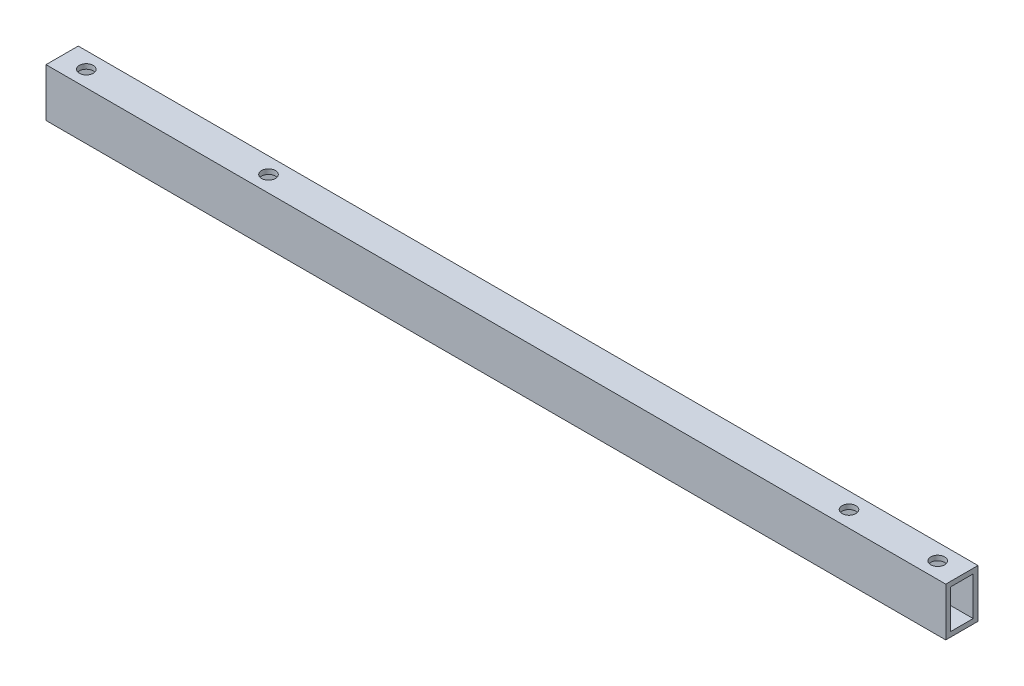
ISO-10303-21;
HEADER;
FILE_DESCRIPTION(('STEP AP214'),'2;1');
FILE_NAME('part.step','',(''),(''),'','','');
FILE_SCHEMA(('AUTOMOTIVE_DESIGN { 1 0 10303 214 1 1 1 1 }'));
ENDSEC;
DATA;
#1=APPLICATION_CONTEXT('core data for automotive mechanical design processes');
#2=APPLICATION_PROTOCOL_DEFINITION('international standard','automotive_design',2000,#1);
#3=PRODUCT_CONTEXT('',#1,'mechanical');
#4=PRODUCT('Part','Part','',(#3));
#5=PRODUCT_RELATED_PRODUCT_CATEGORY('part','',(#4));
#6=PRODUCT_DEFINITION_FORMATION('','',#4);
#7=PRODUCT_DEFINITION_CONTEXT('part definition',#1,'design');
#8=PRODUCT_DEFINITION('design','',#6,#7);
#9=PRODUCT_DEFINITION_SHAPE('','',#8);
#10=(LENGTH_UNIT() NAMED_UNIT(*) SI_UNIT(.MILLI.,.METRE.));
#11=(NAMED_UNIT(*) PLANE_ANGLE_UNIT() SI_UNIT($,.RADIAN.));
#12=(NAMED_UNIT(*) SI_UNIT($,.STERADIAN.) SOLID_ANGLE_UNIT());
#13=UNCERTAINTY_MEASURE_WITH_UNIT(LENGTH_MEASURE(1.E-05),#10,'distance_accuracy_value','');
#14=(GEOMETRIC_REPRESENTATION_CONTEXT(3) GLOBAL_UNCERTAINTY_ASSIGNED_CONTEXT((#13)) GLOBAL_UNIT_ASSIGNED_CONTEXT((#10,
#11,#12)) REPRESENTATION_CONTEXT('',''));
#15=CARTESIAN_POINT('',(0.,0.,0.));
#16=DIRECTION('',(0.,0.,1.));
#17=DIRECTION('',(1.,0.,0.));
#18=AXIS2_PLACEMENT_3D('',#15,#16,#17);
#19=CARTESIAN_POINT('',(279.,0.,0.));
#20=DIRECTION('',(1.,0.,0.));
#21=DIRECTION('',(0.,0.,-1.));
#22=AXIS2_PLACEMENT_3D('',#19,#20,#21);
#23=PLANE('',#22);
#24=DIRECTION('',(0.,1.,0.));
#25=VECTOR('',#24,1.);
#26=CARTESIAN_POINT('',(279.,7.5,-5.));
#27=LINE('',#26,#25);
#28=CARTESIAN_POINT('',(279.,-7.5,-5.));
#29=VERTEX_POINT('',#28);
#30=CARTESIAN_POINT('',(279.,7.5,-5.));
#31=VERTEX_POINT('',#30);
#32=EDGE_CURVE('E164',#29,#31,#27,.T.);
#33=ORIENTED_EDGE('',*,*,#32,.T.);
#34=DIRECTION('',(0.,0.,1.));
#35=VECTOR('',#34,1.);
#36=CARTESIAN_POINT('',(279.,7.5,5.));
#37=LINE('',#36,#35);
#38=CARTESIAN_POINT('',(279.,7.5,5.));
#39=VERTEX_POINT('',#38);
#40=EDGE_CURVE('E167',#31,#39,#37,.T.);
#41=ORIENTED_EDGE('',*,*,#40,.T.);
#42=DIRECTION('',(0.,-1.,0.));
#43=VECTOR('',#42,1.);
#44=CARTESIAN_POINT('',(279.,7.5,5.));
#45=LINE('',#44,#43);
#46=CARTESIAN_POINT('',(279.,-7.5,5.));
#47=VERTEX_POINT('',#46);
#48=EDGE_CURVE('E170',#39,#47,#45,.T.);
#49=ORIENTED_EDGE('',*,*,#48,.T.);
#50=DIRECTION('',(0.,0.,-1.));
#51=VECTOR('',#50,1.);
#52=CARTESIAN_POINT('',(279.,-7.5,5.));
#53=LINE('',#52,#51);
#54=EDGE_CURVE('E172',#47,#29,#53,.T.);
#55=ORIENTED_EDGE('',*,*,#54,.T.);
#56=EDGE_LOOP('',(#33,#41,#49,#55));
#57=FACE_BOUND('',#56,.T.);
#58=DIRECTION('',(0.,0.,1.));
#59=VECTOR('',#58,1.);
#60=CARTESIAN_POINT('',(279.,6.,5.));
#61=LINE('',#60,#59);
#62=CARTESIAN_POINT('',(279.,6.,-3.5));
#63=VERTEX_POINT('',#62);
#64=CARTESIAN_POINT('',(279.,6.,3.5));
#65=VERTEX_POINT('',#64);
#66=EDGE_CURVE('E134',#63,#65,#61,.T.);
#67=ORIENTED_EDGE('',*,*,#66,.F.);
#68=DIRECTION('',(0.,1.,0.));
#69=VECTOR('',#68,1.);
#70=CARTESIAN_POINT('',(279.,7.5,-3.5));
#71=LINE('',#70,#69);
#72=CARTESIAN_POINT('',(279.,-6.,-3.5));
#73=VERTEX_POINT('',#72);
#74=EDGE_CURVE('E126',#73,#63,#71,.T.);
#75=ORIENTED_EDGE('',*,*,#74,.F.);
#76=DIRECTION('',(0.,0.,-1.));
#77=VECTOR('',#76,1.);
#78=CARTESIAN_POINT('',(279.,-6.,5.));
#79=LINE('',#78,#77);
#80=CARTESIAN_POINT('',(279.,-6.,3.5));
#81=VERTEX_POINT('',#80);
#82=EDGE_CURVE('E148',#81,#73,#79,.T.);
#83=ORIENTED_EDGE('',*,*,#82,.F.);
#84=DIRECTION('',(0.,-1.,0.));
#85=VECTOR('',#84,1.);
#86=CARTESIAN_POINT('',(279.,7.5,3.5));
#87=LINE('',#86,#85);
#88=EDGE_CURVE('E146',#65,#81,#87,.T.);
#89=ORIENTED_EDGE('',*,*,#88,.F.);
#90=EDGE_LOOP('',(#67,#75,#83,#89));
#91=FACE_BOUND('',#90,.T.);
#92=ADVANCED_FACE('F59',(#57,#91),#23,.T.);
#93=CARTESIAN_POINT('',(0.,0.,0.));
#94=DIRECTION('',(1.,0.,0.));
#95=DIRECTION('',(0.,0.,-1.));
#96=AXIS2_PLACEMENT_3D('',#93,#94,#95);
#97=PLANE('',#96);
#98=DIRECTION('',(0.,1.,0.));
#99=VECTOR('',#98,1.);
#100=CARTESIAN_POINT('',(0.,7.5,-5.));
#101=LINE('',#100,#99);
#102=CARTESIAN_POINT('',(0.,-7.5,-5.));
#103=VERTEX_POINT('',#102);
#104=CARTESIAN_POINT('',(0.,7.5,-5.));
#105=VERTEX_POINT('',#104);
#106=EDGE_CURVE('E142',#103,#105,#101,.T.);
#107=ORIENTED_EDGE('',*,*,#106,.F.);
#108=DIRECTION('',(0.,0.,-1.));
#109=VECTOR('',#108,1.);
#110=CARTESIAN_POINT('',(0.,-7.5,5.));
#111=LINE('',#110,#109);
#112=CARTESIAN_POINT('',(0.,-7.5,5.));
#113=VERTEX_POINT('',#112);
#114=EDGE_CURVE('E168',#113,#103,#111,.T.);
#115=ORIENTED_EDGE('',*,*,#114,.F.);
#116=DIRECTION('',(0.,-1.,0.));
#117=VECTOR('',#116,1.);
#118=CARTESIAN_POINT('',(0.,7.5,5.));
#119=LINE('',#118,#117);
#120=CARTESIAN_POINT('',(0.,7.5,5.));
#121=VERTEX_POINT('',#120);
#122=EDGE_CURVE('E179',#121,#113,#119,.T.);
#123=ORIENTED_EDGE('',*,*,#122,.F.);
#124=DIRECTION('',(0.,0.,1.));
#125=VECTOR('',#124,1.);
#126=CARTESIAN_POINT('',(0.,7.5,5.));
#127=LINE('',#126,#125);
#128=EDGE_CURVE('E177',#105,#121,#127,.T.);
#129=ORIENTED_EDGE('',*,*,#128,.F.);
#130=EDGE_LOOP('',(#107,#115,#123,#129));
#131=FACE_BOUND('',#130,.T.);
#132=DIRECTION('',(0.,1.,0.));
#133=VECTOR('',#132,1.);
#134=CARTESIAN_POINT('',(0.,7.5,-3.5));
#135=LINE('',#134,#133);
#136=CARTESIAN_POINT('',(0.,-6.,-3.5));
#137=VERTEX_POINT('',#136);
#138=CARTESIAN_POINT('',(0.,6.,-3.5));
#139=VERTEX_POINT('',#138);
#140=EDGE_CURVE('E84',#137,#139,#135,.T.);
#141=ORIENTED_EDGE('',*,*,#140,.T.);
#142=DIRECTION('',(0.,0.,1.));
#143=VECTOR('',#142,1.);
#144=CARTESIAN_POINT('',(0.,6.,5.));
#145=LINE('',#144,#143);
#146=CARTESIAN_POINT('',(0.,6.,3.5));
#147=VERTEX_POINT('',#146);
#148=EDGE_CURVE('E141',#139,#147,#145,.T.);
#149=ORIENTED_EDGE('',*,*,#148,.T.);
#150=DIRECTION('',(0.,-1.,0.));
#151=VECTOR('',#150,1.);
#152=CARTESIAN_POINT('',(0.,7.5,3.5));
#153=LINE('',#152,#151);
#154=CARTESIAN_POINT('',(0.,-6.,3.5));
#155=VERTEX_POINT('',#154);
#156=EDGE_CURVE('E156',#147,#155,#153,.T.);
#157=ORIENTED_EDGE('',*,*,#156,.T.);
#158=DIRECTION('',(0.,0.,-1.));
#159=VECTOR('',#158,1.);
#160=CARTESIAN_POINT('',(0.,-6.,5.));
#161=LINE('',#160,#159);
#162=EDGE_CURVE('E135',#155,#137,#161,.T.);
#163=ORIENTED_EDGE('',*,*,#162,.T.);
#164=EDGE_LOOP('',(#141,#149,#157,#163));
#165=FACE_BOUND('',#164,.T.);
#166=ADVANCED_FACE('F231',(#131,#165),#97,.F.);
#167=CARTESIAN_POINT('',(279.,7.5,-5.));
#168=DIRECTION('',(0.,0.,1.));
#169=DIRECTION('',(0.,-1.,0.));
#170=AXIS2_PLACEMENT_3D('',#167,#168,#169);
#171=PLANE('',#170);
#172=ORIENTED_EDGE('',*,*,#106,.T.);
#173=DIRECTION('',(-1.,0.,0.));
#174=VECTOR('',#173,1.);
#175=CARTESIAN_POINT('',(279.,7.5,-5.));
#176=LINE('',#175,#174);
#177=EDGE_CURVE('E12',#31,#105,#176,.T.);
#178=ORIENTED_EDGE('',*,*,#177,.F.);
#179=ORIENTED_EDGE('',*,*,#32,.F.);
#180=DIRECTION('',(-1.,0.,0.));
#181=VECTOR('',#180,1.);
#182=CARTESIAN_POINT('',(279.,-7.5,-5.));
#183=LINE('',#182,#181);
#184=EDGE_CURVE('E174',#29,#103,#183,.T.);
#185=ORIENTED_EDGE('',*,*,#184,.T.);
#186=EDGE_LOOP('',(#172,#178,#179,#185));
#187=FACE_BOUND('',#186,.T.);
#188=ADVANCED_FACE('F61',(#187),#171,.F.);
#189=CARTESIAN_POINT('',(279.,7.5,5.));
#190=DIRECTION('',(0.,-1.,0.));
#191=DIRECTION('',(0.,0.,-1.));
#192=AXIS2_PLACEMENT_3D('',#189,#190,#191);
#193=PLANE('',#192);
#194=CARTESIAN_POINT('',(271.5,7.5,0.));
#195=DIRECTION('',(0.,1.,0.));
#196=DIRECTION('',(0.,0.,1.));
#197=AXIS2_PLACEMENT_3D('',#194,#195,#196);
#198=CIRCLE('',#197,2.15000000000002);
#199=CARTESIAN_POINT('',(271.5,7.5,2.15000000000002));
#200=VERTEX_POINT('',#199);
#201=EDGE_CURVE('E267',#200,#200,#198,.T.);
#202=ORIENTED_EDGE('',*,*,#201,.F.);
#203=EDGE_LOOP('',(#202));
#204=FACE_BOUND('',#203,.T.);
#205=CARTESIAN_POINT('',(7.50000000000001,7.5,0.));
#206=DIRECTION('',(0.,1.,0.));
#207=DIRECTION('',(0.,0.,-1.));
#208=AXIS2_PLACEMENT_3D('',#205,#206,#207);
#209=CIRCLE('',#208,2.15000000000002);
#210=CARTESIAN_POINT('',(7.50000000000001,7.5,-2.15000000000002));
#211=VERTEX_POINT('',#210);
#212=EDGE_CURVE('E271',#211,#211,#209,.T.);
#213=ORIENTED_EDGE('',*,*,#212,.F.);
#214=EDGE_LOOP('',(#213));
#215=FACE_BOUND('',#214,.T.);
#216=CARTESIAN_POINT('',(64.,7.5,0.));
#217=DIRECTION('',(0.,1.,0.));
#218=DIRECTION('',(0.,0.,-1.));
#219=AXIS2_PLACEMENT_3D('',#216,#217,#218);
#220=CIRCLE('',#219,2.15);
#221=CARTESIAN_POINT('',(64.,7.5,-2.15));
#222=VERTEX_POINT('',#221);
#223=EDGE_CURVE('E275',#222,#222,#220,.T.);
#224=ORIENTED_EDGE('',*,*,#223,.F.);
#225=EDGE_LOOP('',(#224));
#226=FACE_BOUND('',#225,.T.);
#227=CARTESIAN_POINT('',(244.,7.5,0.));
#228=DIRECTION('',(0.,1.,0.));
#229=DIRECTION('',(0.,0.,1.));
#230=AXIS2_PLACEMENT_3D('',#227,#228,#229);
#231=CIRCLE('',#230,2.14999999999996);
#232=CARTESIAN_POINT('',(244.,7.5,2.14999999999991));
#233=VERTEX_POINT('',#232);
#234=EDGE_CURVE('E279',#233,#233,#231,.T.);
#235=ORIENTED_EDGE('',*,*,#234,.F.);
#236=EDGE_LOOP('',(#235));
#237=FACE_BOUND('',#236,.T.);
#238=ORIENTED_EDGE('',*,*,#128,.T.);
#239=DIRECTION('',(-1.,0.,0.));
#240=VECTOR('',#239,1.);
#241=CARTESIAN_POINT('',(279.,7.5,5.));
#242=LINE('',#241,#240);
#243=EDGE_CURVE('E68',#39,#121,#242,.T.);
#244=ORIENTED_EDGE('',*,*,#243,.F.);
#245=ORIENTED_EDGE('',*,*,#40,.F.);
#246=ORIENTED_EDGE('',*,*,#177,.T.);
#247=EDGE_LOOP('',(#238,#244,#245,#246));
#248=FACE_BOUND('',#247,.T.);
#249=ADVANCED_FACE('F256',(#204,#215,#226,#237,#248),#193,.F.);
#250=CARTESIAN_POINT('',(279.,7.5,5.));
#251=DIRECTION('',(0.,0.,-1.));
#252=DIRECTION('',(0.,1.,0.));
#253=AXIS2_PLACEMENT_3D('',#250,#251,#252);
#254=PLANE('',#253);
#255=ORIENTED_EDGE('',*,*,#122,.T.);
#256=DIRECTION('',(-1.,0.,0.));
#257=VECTOR('',#256,1.);
#258=CARTESIAN_POINT('',(279.,-7.5,5.));
#259=LINE('',#258,#257);
#260=EDGE_CURVE('E184',#47,#113,#259,.T.);
#261=ORIENTED_EDGE('',*,*,#260,.F.);
#262=ORIENTED_EDGE('',*,*,#48,.F.);
#263=ORIENTED_EDGE('',*,*,#243,.T.);
#264=EDGE_LOOP('',(#255,#261,#262,#263));
#265=FACE_BOUND('',#264,.T.);
#266=ADVANCED_FACE('F253',(#265),#254,.F.);
#267=CARTESIAN_POINT('',(279.,-7.5,5.));
#268=DIRECTION('',(0.,1.,0.));
#269=DIRECTION('',(0.,0.,1.));
#270=AXIS2_PLACEMENT_3D('',#267,#268,#269);
#271=PLANE('',#270);
#272=CARTESIAN_POINT('',(271.5,-7.5,0.));
#273=DIRECTION('',(0.,1.,0.));
#274=DIRECTION('',(0.,0.,1.));
#275=AXIS2_PLACEMENT_3D('',#272,#273,#274);
#276=CIRCLE('',#275,2.15000000000002);
#277=CARTESIAN_POINT('',(271.5,-7.5,2.15000000000002));
#278=VERTEX_POINT('',#277);
#279=EDGE_CURVE('E193',#278,#278,#276,.T.);
#280=ORIENTED_EDGE('',*,*,#279,.T.);
#281=EDGE_LOOP('',(#280));
#282=FACE_BOUND('',#281,.T.);
#283=CARTESIAN_POINT('',(7.50000000000001,-7.5,0.));
#284=DIRECTION('',(0.,1.,0.));
#285=DIRECTION('',(0.,0.,-1.));
#286=AXIS2_PLACEMENT_3D('',#283,#284,#285);
#287=CIRCLE('',#286,2.15000000000002);
#288=CARTESIAN_POINT('',(7.50000000000001,-7.5,-2.15000000000002));
#289=VERTEX_POINT('',#288);
#290=EDGE_CURVE('E301',#289,#289,#287,.T.);
#291=ORIENTED_EDGE('',*,*,#290,.T.);
#292=EDGE_LOOP('',(#291));
#293=FACE_BOUND('',#292,.T.);
#294=CARTESIAN_POINT('',(64.,-7.5,0.));
#295=DIRECTION('',(0.,1.,0.));
#296=DIRECTION('',(0.,0.,-1.));
#297=AXIS2_PLACEMENT_3D('',#294,#295,#296);
#298=CIRCLE('',#297,2.15);
#299=CARTESIAN_POINT('',(64.,-7.5,-2.15));
#300=VERTEX_POINT('',#299);
#301=EDGE_CURVE('E297',#300,#300,#298,.T.);
#302=ORIENTED_EDGE('',*,*,#301,.T.);
#303=EDGE_LOOP('',(#302));
#304=FACE_BOUND('',#303,.T.);
#305=CARTESIAN_POINT('',(244.,-7.5,0.));
#306=DIRECTION('',(0.,1.,0.));
#307=DIRECTION('',(0.,0.,1.));
#308=AXIS2_PLACEMENT_3D('',#305,#306,#307);
#309=CIRCLE('',#308,2.14999999999996);
#310=CARTESIAN_POINT('',(244.,-7.5,2.14999999999991));
#311=VERTEX_POINT('',#310);
#312=EDGE_CURVE('E292',#311,#311,#309,.T.);
#313=ORIENTED_EDGE('',*,*,#312,.T.);
#314=EDGE_LOOP('',(#313));
#315=FACE_BOUND('',#314,.T.);
#316=ORIENTED_EDGE('',*,*,#114,.T.);
#317=ORIENTED_EDGE('',*,*,#184,.F.);
#318=ORIENTED_EDGE('',*,*,#54,.F.);
#319=ORIENTED_EDGE('',*,*,#260,.T.);
#320=EDGE_LOOP('',(#316,#317,#318,#319));
#321=FACE_BOUND('',#320,.T.);
#322=ADVANCED_FACE('F250',(#282,#293,#304,#315,#321),#271,.F.);
#323=CARTESIAN_POINT('',(279.,7.5,-3.5));
#324=DIRECTION('',(0.,0.,1.));
#325=DIRECTION('',(0.,-1.,0.));
#326=AXIS2_PLACEMENT_3D('',#323,#324,#325);
#327=PLANE('',#326);
#328=ORIENTED_EDGE('',*,*,#140,.F.);
#329=DIRECTION('',(-1.,0.,0.));
#330=VECTOR('',#329,1.);
#331=CARTESIAN_POINT('',(279.,-6.,-3.5));
#332=LINE('',#331,#330);
#333=EDGE_CURVE('E130',#73,#137,#332,.T.);
#334=ORIENTED_EDGE('',*,*,#333,.F.);
#335=ORIENTED_EDGE('',*,*,#74,.T.);
#336=DIRECTION('',(-1.,0.,0.));
#337=VECTOR('',#336,1.);
#338=CARTESIAN_POINT('',(279.,6.,-3.5));
#339=LINE('',#338,#337);
#340=EDGE_CURVE('E129',#63,#139,#339,.T.);
#341=ORIENTED_EDGE('',*,*,#340,.T.);
#342=EDGE_LOOP('',(#328,#334,#335,#341));
#343=FACE_BOUND('',#342,.T.);
#344=ADVANCED_FACE('F128',(#343),#327,.T.);
#345=CARTESIAN_POINT('',(279.,6.,5.));
#346=DIRECTION('',(0.,-1.,0.));
#347=DIRECTION('',(0.,0.,-1.));
#348=AXIS2_PLACEMENT_3D('',#345,#346,#347);
#349=PLANE('',#348);
#350=CARTESIAN_POINT('',(271.5,6.,0.));
#351=DIRECTION('',(0.,-1.,0.));
#352=DIRECTION('',(0.,0.,-1.));
#353=AXIS2_PLACEMENT_3D('',#350,#351,#352);
#354=CIRCLE('',#353,2.15000000000002);
#355=CARTESIAN_POINT('',(271.5,6.,-2.15000000000002));
#356=VERTEX_POINT('',#355);
#357=EDGE_CURVE('E154',#356,#356,#354,.T.);
#358=ORIENTED_EDGE('',*,*,#357,.F.);
#359=EDGE_LOOP('',(#358));
#360=FACE_BOUND('',#359,.T.);
#361=CARTESIAN_POINT('',(7.50000000000001,6.,0.));
#362=DIRECTION('',(0.,-1.,0.));
#363=DIRECTION('',(0.,0.,-1.));
#364=AXIS2_PLACEMENT_3D('',#361,#362,#363);
#365=CIRCLE('',#364,2.15000000000002);
#366=CARTESIAN_POINT('',(7.50000000000001,6.,-2.15000000000002));
#367=VERTEX_POINT('',#366);
#368=EDGE_CURVE('E199',#367,#367,#365,.T.);
#369=ORIENTED_EDGE('',*,*,#368,.F.);
#370=EDGE_LOOP('',(#369));
#371=FACE_BOUND('',#370,.T.);
#372=CARTESIAN_POINT('',(64.,6.,0.));
#373=DIRECTION('',(0.,-1.,0.));
#374=DIRECTION('',(0.,0.,-1.));
#375=AXIS2_PLACEMENT_3D('',#372,#373,#374);
#376=CIRCLE('',#375,2.15);
#377=CARTESIAN_POINT('',(64.,6.,-2.15));
#378=VERTEX_POINT('',#377);
#379=EDGE_CURVE('E196',#378,#378,#376,.T.);
#380=ORIENTED_EDGE('',*,*,#379,.F.);
#381=EDGE_LOOP('',(#380));
#382=FACE_BOUND('',#381,.T.);
#383=CARTESIAN_POINT('',(244.,6.,0.));
#384=DIRECTION('',(0.,-1.,0.));
#385=DIRECTION('',(0.,0.,-1.));
#386=AXIS2_PLACEMENT_3D('',#383,#384,#385);
#387=CIRCLE('',#386,2.14999999999996);
#388=CARTESIAN_POINT('',(244.,6.,-2.15));
#389=VERTEX_POINT('',#388);
#390=EDGE_CURVE('E192',#389,#389,#387,.T.);
#391=ORIENTED_EDGE('',*,*,#390,.F.);
#392=EDGE_LOOP('',(#391));
#393=FACE_BOUND('',#392,.T.);
#394=ORIENTED_EDGE('',*,*,#148,.F.);
#395=ORIENTED_EDGE('',*,*,#340,.F.);
#396=ORIENTED_EDGE('',*,*,#66,.T.);
#397=DIRECTION('',(-1.,0.,0.));
#398=VECTOR('',#397,1.);
#399=CARTESIAN_POINT('',(279.,6.,3.5));
#400=LINE('',#399,#398);
#401=EDGE_CURVE('E143',#65,#147,#400,.T.);
#402=ORIENTED_EDGE('',*,*,#401,.T.);
#403=EDGE_LOOP('',(#394,#395,#396,#402));
#404=FACE_BOUND('',#403,.T.);
#405=ADVANCED_FACE('F138',(#360,#371,#382,#393,#404),#349,.T.);
#406=CARTESIAN_POINT('',(279.,7.5,3.5));
#407=DIRECTION('',(0.,0.,-1.));
#408=DIRECTION('',(0.,1.,0.));
#409=AXIS2_PLACEMENT_3D('',#406,#407,#408);
#410=PLANE('',#409);
#411=ORIENTED_EDGE('',*,*,#156,.F.);
#412=ORIENTED_EDGE('',*,*,#401,.F.);
#413=ORIENTED_EDGE('',*,*,#88,.T.);
#414=DIRECTION('',(-1.,0.,0.));
#415=VECTOR('',#414,1.);
#416=CARTESIAN_POINT('',(279.,-6.,3.5));
#417=LINE('',#416,#415);
#418=EDGE_CURVE('E76',#81,#155,#417,.T.);
#419=ORIENTED_EDGE('',*,*,#418,.T.);
#420=EDGE_LOOP('',(#411,#412,#413,#419));
#421=FACE_BOUND('',#420,.T.);
#422=ADVANCED_FACE('F223',(#421),#410,.T.);
#423=CARTESIAN_POINT('',(279.,-6.,5.));
#424=DIRECTION('',(0.,1.,0.));
#425=DIRECTION('',(0.,0.,1.));
#426=AXIS2_PLACEMENT_3D('',#423,#424,#425);
#427=PLANE('',#426);
#428=CARTESIAN_POINT('',(271.5,-6.,0.));
#429=DIRECTION('',(0.,1.,0.));
#430=DIRECTION('',(0.,0.,1.));
#431=AXIS2_PLACEMENT_3D('',#428,#429,#430);
#432=CIRCLE('',#431,2.15000000000002);
#433=CARTESIAN_POINT('',(271.5,-6.,2.15000000000002));
#434=VERTEX_POINT('',#433);
#435=EDGE_CURVE('E63',#434,#434,#432,.T.);
#436=ORIENTED_EDGE('',*,*,#435,.F.);
#437=EDGE_LOOP('',(#436));
#438=FACE_BOUND('',#437,.T.);
#439=CARTESIAN_POINT('',(7.50000000000001,-6.,0.));
#440=DIRECTION('',(0.,1.,0.));
#441=DIRECTION('',(0.,0.,1.));
#442=AXIS2_PLACEMENT_3D('',#439,#440,#441);
#443=CIRCLE('',#442,2.15000000000002);
#444=CARTESIAN_POINT('',(7.50000000000001,-6.,2.15000000000001));
#445=VERTEX_POINT('',#444);
#446=EDGE_CURVE('E197',#445,#445,#443,.T.);
#447=ORIENTED_EDGE('',*,*,#446,.F.);
#448=EDGE_LOOP('',(#447));
#449=FACE_BOUND('',#448,.T.);
#450=CARTESIAN_POINT('',(64.,-6.,0.));
#451=DIRECTION('',(0.,1.,0.));
#452=DIRECTION('',(0.,0.,1.));
#453=AXIS2_PLACEMENT_3D('',#450,#451,#452);
#454=CIRCLE('',#453,2.15);
#455=CARTESIAN_POINT('',(64.,-6.,2.15));
#456=VERTEX_POINT('',#455);
#457=EDGE_CURVE('E194',#456,#456,#454,.T.);
#458=ORIENTED_EDGE('',*,*,#457,.F.);
#459=EDGE_LOOP('',(#458));
#460=FACE_BOUND('',#459,.T.);
#461=CARTESIAN_POINT('',(244.,-6.,0.));
#462=DIRECTION('',(0.,1.,0.));
#463=DIRECTION('',(0.,0.,1.));
#464=AXIS2_PLACEMENT_3D('',#461,#462,#463);
#465=CIRCLE('',#464,2.14999999999996);
#466=CARTESIAN_POINT('',(244.,-6.,2.14999999999991));
#467=VERTEX_POINT('',#466);
#468=EDGE_CURVE('E189',#467,#467,#465,.T.);
#469=ORIENTED_EDGE('',*,*,#468,.F.);
#470=EDGE_LOOP('',(#469));
#471=FACE_BOUND('',#470,.T.);
#472=ORIENTED_EDGE('',*,*,#162,.F.);
#473=ORIENTED_EDGE('',*,*,#418,.F.);
#474=ORIENTED_EDGE('',*,*,#82,.T.);
#475=ORIENTED_EDGE('',*,*,#333,.T.);
#476=EDGE_LOOP('',(#472,#473,#474,#475));
#477=FACE_BOUND('',#476,.T.);
#478=ADVANCED_FACE('F219',(#438,#449,#460,#471,#477),#427,.T.);
#479=CARTESIAN_POINT('',(244.,-7.5,0.));
#480=DIRECTION('',(0.,1.,0.));
#481=DIRECTION('',(0.,0.,1.));
#482=AXIS2_PLACEMENT_3D('',#479,#480,#481);
#483=CYLINDRICAL_SURFACE('',#482,2.14999999999996);
#484=ORIENTED_EDGE('',*,*,#468,.T.);
#485=EDGE_LOOP('',(#484));
#486=FACE_BOUND('',#485,.T.);
#487=ORIENTED_EDGE('',*,*,#312,.F.);
#488=EDGE_LOOP('',(#487));
#489=FACE_BOUND('',#488,.T.);
#490=ADVANCED_FACE('F222',(#486,#489),#483,.F.);
#491=CARTESIAN_POINT('',(64.,-7.5,0.));
#492=DIRECTION('',(0.,1.,0.));
#493=DIRECTION('',(0.,0.,1.));
#494=AXIS2_PLACEMENT_3D('',#491,#492,#493);
#495=CYLINDRICAL_SURFACE('',#494,2.15);
#496=ORIENTED_EDGE('',*,*,#457,.T.);
#497=EDGE_LOOP('',(#496));
#498=FACE_BOUND('',#497,.T.);
#499=ORIENTED_EDGE('',*,*,#301,.F.);
#500=EDGE_LOOP('',(#499));
#501=FACE_BOUND('',#500,.T.);
#502=ADVANCED_FACE('F320',(#498,#501),#495,.F.);
#503=CARTESIAN_POINT('',(7.50000000000001,-7.5,0.));
#504=DIRECTION('',(0.,1.,0.));
#505=DIRECTION('',(0.,0.,1.));
#506=AXIS2_PLACEMENT_3D('',#503,#504,#505);
#507=CYLINDRICAL_SURFACE('',#506,2.15000000000002);
#508=ORIENTED_EDGE('',*,*,#446,.T.);
#509=EDGE_LOOP('',(#508));
#510=FACE_BOUND('',#509,.T.);
#511=ORIENTED_EDGE('',*,*,#290,.F.);
#512=EDGE_LOOP('',(#511));
#513=FACE_BOUND('',#512,.T.);
#514=ADVANCED_FACE('F310',(#510,#513),#507,.F.);
#515=CARTESIAN_POINT('',(271.5,-7.5,0.));
#516=DIRECTION('',(0.,1.,0.));
#517=DIRECTION('',(0.,0.,1.));
#518=AXIS2_PLACEMENT_3D('',#515,#516,#517);
#519=CYLINDRICAL_SURFACE('',#518,2.15000000000002);
#520=ORIENTED_EDGE('',*,*,#435,.T.);
#521=EDGE_LOOP('',(#520));
#522=FACE_BOUND('',#521,.T.);
#523=ORIENTED_EDGE('',*,*,#279,.F.);
#524=EDGE_LOOP('',(#523));
#525=FACE_BOUND('',#524,.T.);
#526=ADVANCED_FACE('F216',(#522,#525),#519,.F.);
#527=ORIENTED_EDGE('',*,*,#390,.T.);
#528=EDGE_LOOP('',(#527));
#529=FACE_BOUND('',#528,.T.);
#530=ORIENTED_EDGE('',*,*,#234,.T.);
#531=EDGE_LOOP('',(#530));
#532=FACE_BOUND('',#531,.T.);
#533=ADVANCED_FACE('F309',(#529,#532),#483,.F.);
#534=ORIENTED_EDGE('',*,*,#379,.T.);
#535=EDGE_LOOP('',(#534));
#536=FACE_BOUND('',#535,.T.);
#537=ORIENTED_EDGE('',*,*,#223,.T.);
#538=EDGE_LOOP('',(#537));
#539=FACE_BOUND('',#538,.T.);
#540=ADVANCED_FACE('F317',(#536,#539),#495,.F.);
#541=ORIENTED_EDGE('',*,*,#368,.T.);
#542=EDGE_LOOP('',(#541));
#543=FACE_BOUND('',#542,.T.);
#544=ORIENTED_EDGE('',*,*,#212,.T.);
#545=EDGE_LOOP('',(#544));
#546=FACE_BOUND('',#545,.T.);
#547=ADVANCED_FACE('F322',(#543,#546),#507,.F.);
#548=ORIENTED_EDGE('',*,*,#357,.T.);
#549=EDGE_LOOP('',(#548));
#550=FACE_BOUND('',#549,.T.);
#551=ORIENTED_EDGE('',*,*,#201,.T.);
#552=EDGE_LOOP('',(#551));
#553=FACE_BOUND('',#552,.T.);
#554=ADVANCED_FACE('F312',(#550,#553),#519,.F.);
#555=CLOSED_SHELL('',(#92,#166,#188,#249,#266,#322,#344,#405,#422,#478,#490,#502,#514,#526,#533,
#540,#547,#554));
#556=MANIFOLD_SOLID_BREP('B2',#555);
#557=ADVANCED_BREP_SHAPE_REPRESENTATION('',(#18,#556),#14);
#558=SHAPE_DEFINITION_REPRESENTATION(#9,#557);
ENDSEC;
END-ISO-10303-21;
